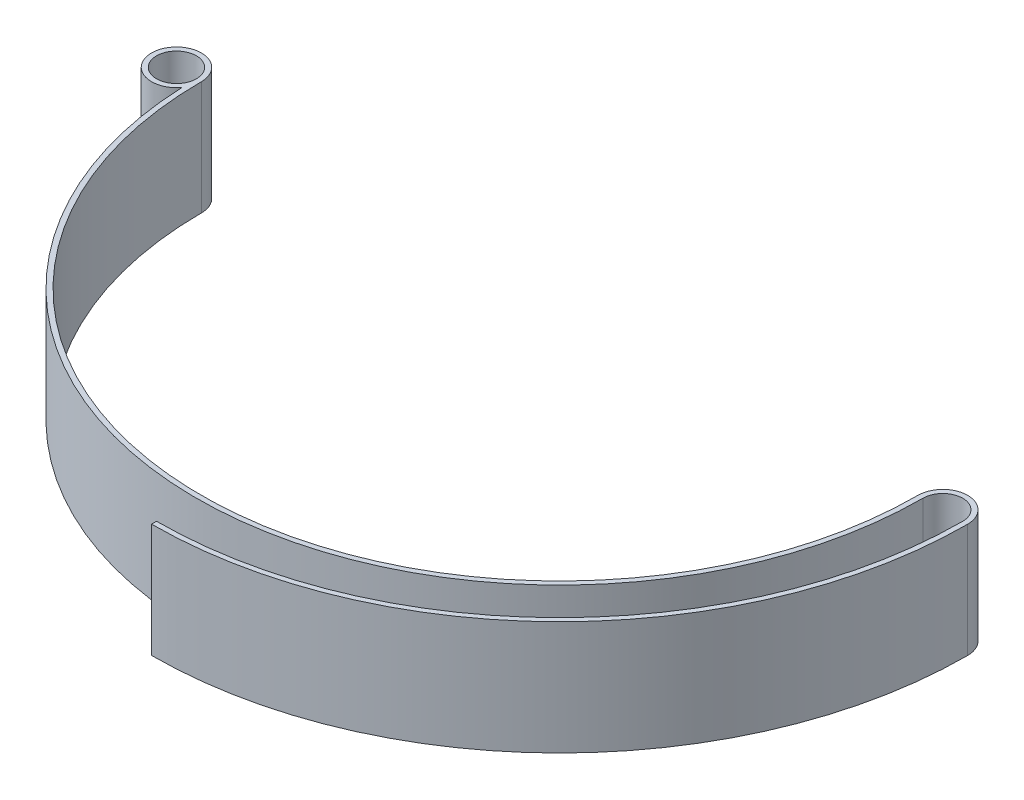
ISO-10303-21;
HEADER;
FILE_DESCRIPTION(('STEP AP214'),'2;1');
FILE_NAME('part.step','',(''),(''),'','','');
FILE_SCHEMA(('AUTOMOTIVE_DESIGN { 1 0 10303 214 1 1 1 1 }'));
ENDSEC;
DATA;
#1=APPLICATION_CONTEXT('core data for automotive mechanical design processes');
#2=APPLICATION_PROTOCOL_DEFINITION('international standard','automotive_design',2000,#1);
#3=PRODUCT_CONTEXT('',#1,'mechanical');
#4=PRODUCT('Part','Part','',(#3));
#5=PRODUCT_RELATED_PRODUCT_CATEGORY('part','',(#4));
#6=PRODUCT_DEFINITION_FORMATION('','',#4);
#7=PRODUCT_DEFINITION_CONTEXT('part definition',#1,'design');
#8=PRODUCT_DEFINITION('design','',#6,#7);
#9=PRODUCT_DEFINITION_SHAPE('','',#8);
#10=(LENGTH_UNIT() NAMED_UNIT(*) SI_UNIT(.MILLI.,.METRE.));
#11=(NAMED_UNIT(*) PLANE_ANGLE_UNIT() SI_UNIT($,.RADIAN.));
#12=(NAMED_UNIT(*) SI_UNIT($,.STERADIAN.) SOLID_ANGLE_UNIT());
#13=UNCERTAINTY_MEASURE_WITH_UNIT(LENGTH_MEASURE(1.E-05),#10,'distance_accuracy_value','');
#14=(GEOMETRIC_REPRESENTATION_CONTEXT(3) GLOBAL_UNCERTAINTY_ASSIGNED_CONTEXT((#13)) GLOBAL_UNIT_ASSIGNED_CONTEXT((#10,
#11,#12)) REPRESENTATION_CONTEXT('',''));
#15=CARTESIAN_POINT('',(0.,0.,0.));
#16=DIRECTION('',(0.,0.,1.));
#17=DIRECTION('',(1.,0.,0.));
#18=AXIS2_PLACEMENT_3D('',#15,#16,#17);
#19=CARTESIAN_POINT('',(0.,22.806,0.));
#20=DIRECTION('',(0.,1.,0.));
#21=DIRECTION('',(0.,0.,1.));
#22=AXIS2_PLACEMENT_3D('',#19,#20,#21);
#23=PLANE('',#22);
#24=CARTESIAN_POINT('',(0.,22.806,0.));
#25=DIRECTION('',(0.,1.,0.));
#26=DIRECTION('',(0.,0.,1.));
#27=AXIS2_PLACEMENT_3D('',#24,#25,#26);
#28=CIRCLE('',#27,5.);
#29=CARTESIAN_POINT('',(5.,22.806,0.));
#30=VERTEX_POINT('',#29);
#31=CARTESIAN_POINT('',(4.0585594378294,22.806,2.92029027488806));
#32=VERTEX_POINT('',#31);
#33=EDGE_CURVE('E145',#30,#32,#28,.T.);
#34=ORIENTED_EDGE('',*,*,#33,.T.);
#35=CARTESIAN_POINT('',(76.845,22.806,0.));
#36=DIRECTION('',(0.,1.,0.));
#37=DIRECTION('',(0.,0.,1.));
#38=AXIS2_PLACEMENT_3D('',#35,#36,#37);
#39=CIRCLE('',#38,72.845);
#40=CARTESIAN_POINT('',(149.69,22.806,0.));
#41=VERTEX_POINT('',#40);
#42=EDGE_CURVE('E93',#32,#41,#39,.T.);
#43=ORIENTED_EDGE('',*,*,#42,.T.);
#44=CARTESIAN_POINT('',(153.69,22.806,0.));
#45=DIRECTION('',(0.,-1.,0.));
#46=DIRECTION('',(0.,0.,-1.));
#47=AXIS2_PLACEMENT_3D('',#44,#45,#46);
#48=CIRCLE('',#47,4.);
#49=CARTESIAN_POINT('',(157.69,22.806,0.));
#50=VERTEX_POINT('',#49);
#51=EDGE_CURVE('E160',#41,#50,#48,.T.);
#52=ORIENTED_EDGE('',*,*,#51,.T.);
#53=CARTESIAN_POINT('',(76.845,22.806,0.));
#54=DIRECTION('',(0.,-1.,0.));
#55=DIRECTION('',(0.,0.,-1.));
#56=AXIS2_PLACEMENT_3D('',#53,#54,#55);
#57=CIRCLE('',#56,80.845);
#58=CARTESIAN_POINT('',(76.845,22.806,80.845));
#59=VERTEX_POINT('',#58);
#60=EDGE_CURVE('E173',#50,#59,#57,.T.);
#61=ORIENTED_EDGE('',*,*,#60,.T.);
#62=DIRECTION('',(0.,0.,1.));
#63=VECTOR('',#62,1.);
#64=CARTESIAN_POINT('',(76.845,22.806,80.845));
#65=LINE('',#64,#63);
#66=CARTESIAN_POINT('',(76.845,22.806,81.845));
#67=VERTEX_POINT('',#66);
#68=EDGE_CURVE('E112',#59,#67,#65,.T.);
#69=ORIENTED_EDGE('',*,*,#68,.T.);
#70=CARTESIAN_POINT('',(76.845,22.806,0.));
#71=DIRECTION('',(0.,1.,0.));
#72=DIRECTION('',(0.,0.,-1.));
#73=AXIS2_PLACEMENT_3D('',#70,#71,#72);
#74=CIRCLE('',#73,81.845);
#75=CARTESIAN_POINT('',(158.69,22.806,0.));
#76=VERTEX_POINT('',#75);
#77=EDGE_CURVE('E106',#67,#76,#74,.T.);
#78=ORIENTED_EDGE('',*,*,#77,.T.);
#79=CARTESIAN_POINT('',(153.69,22.806,0.));
#80=DIRECTION('',(0.,1.,0.));
#81=DIRECTION('',(0.,0.,-1.));
#82=AXIS2_PLACEMENT_3D('',#79,#80,#81);
#83=CIRCLE('',#82,4.99999999999999);
#84=CARTESIAN_POINT('',(148.69,22.806,0.));
#85=VERTEX_POINT('',#84);
#86=EDGE_CURVE('E110',#76,#85,#83,.T.);
#87=ORIENTED_EDGE('',*,*,#86,.T.);
#88=CARTESIAN_POINT('',(76.845,22.806,0.));
#89=DIRECTION('',(0.,-1.,0.));
#90=DIRECTION('',(0.,0.,1.));
#91=AXIS2_PLACEMENT_3D('',#88,#89,#90);
#92=CIRCLE('',#91,71.845);
#93=EDGE_CURVE('E50',#85,#30,#92,.T.);
#94=ORIENTED_EDGE('',*,*,#93,.T.);
#95=EDGE_LOOP('',(#34,#43,#52,#61,#69,#78,#87,#94));
#96=FACE_BOUND('',#95,.T.);
#97=CARTESIAN_POINT('',(0.,22.806,0.));
#98=DIRECTION('',(0.,1.,0.));
#99=DIRECTION('',(0.,0.,1.));
#100=AXIS2_PLACEMENT_3D('',#97,#98,#99);
#101=CIRCLE('',#100,4.);
#102=CARTESIAN_POINT('',(0.,22.806,4.));
#103=VERTEX_POINT('',#102);
#104=EDGE_CURVE('E134',#103,#103,#101,.T.);
#105=ORIENTED_EDGE('',*,*,#104,.F.);
#106=EDGE_LOOP('',(#105));
#107=FACE_BOUND('',#106,.T.);
#108=ADVANCED_FACE('F33',(#96,#107),#23,.T.);
#109=CARTESIAN_POINT('',(0.,0.,0.));
#110=DIRECTION('',(0.,1.,0.));
#111=DIRECTION('',(0.,0.,1.));
#112=AXIS2_PLACEMENT_3D('',#109,#110,#111);
#113=PLANE('',#112);
#114=CARTESIAN_POINT('',(0.,0.,0.));
#115=DIRECTION('',(0.,1.,0.));
#116=DIRECTION('',(0.,0.,1.));
#117=AXIS2_PLACEMENT_3D('',#114,#115,#116);
#118=CIRCLE('',#117,5.);
#119=CARTESIAN_POINT('',(5.,0.,0.));
#120=VERTEX_POINT('',#119);
#121=CARTESIAN_POINT('',(4.0585594378294,0.,2.92029027488806));
#122=VERTEX_POINT('',#121);
#123=EDGE_CURVE('E130',#120,#122,#118,.T.);
#124=ORIENTED_EDGE('',*,*,#123,.F.);
#125=CARTESIAN_POINT('',(76.845,0.,0.));
#126=DIRECTION('',(0.,-1.,0.));
#127=DIRECTION('',(0.,0.,1.));
#128=AXIS2_PLACEMENT_3D('',#125,#126,#127);
#129=CIRCLE('',#128,71.845);
#130=CARTESIAN_POINT('',(148.69,0.,0.));
#131=VERTEX_POINT('',#130);
#132=EDGE_CURVE('E85',#131,#120,#129,.T.);
#133=ORIENTED_EDGE('',*,*,#132,.F.);
#134=CARTESIAN_POINT('',(153.69,0.,0.));
#135=DIRECTION('',(0.,1.,0.));
#136=DIRECTION('',(0.,0.,-1.));
#137=AXIS2_PLACEMENT_3D('',#134,#135,#136);
#138=CIRCLE('',#137,4.99999999999999);
#139=CARTESIAN_POINT('',(158.69,0.,0.));
#140=VERTEX_POINT('',#139);
#141=EDGE_CURVE('E79',#140,#131,#138,.T.);
#142=ORIENTED_EDGE('',*,*,#141,.F.);
#143=CARTESIAN_POINT('',(76.845,0.,0.));
#144=DIRECTION('',(0.,1.,0.));
#145=DIRECTION('',(0.,0.,-1.));
#146=AXIS2_PLACEMENT_3D('',#143,#144,#145);
#147=CIRCLE('',#146,81.845);
#148=CARTESIAN_POINT('',(76.845,0.,81.845));
#149=VERTEX_POINT('',#148);
#150=EDGE_CURVE('E120',#149,#140,#147,.T.);
#151=ORIENTED_EDGE('',*,*,#150,.F.);
#152=DIRECTION('',(0.,0.,1.));
#153=VECTOR('',#152,1.);
#154=CARTESIAN_POINT('',(76.845,0.,80.845));
#155=LINE('',#154,#153);
#156=CARTESIAN_POINT('',(76.845,0.,80.845));
#157=VERTEX_POINT('',#156);
#158=EDGE_CURVE('E140',#157,#149,#155,.T.);
#159=ORIENTED_EDGE('',*,*,#158,.F.);
#160=CARTESIAN_POINT('',(76.845,0.,0.));
#161=DIRECTION('',(0.,-1.,0.));
#162=DIRECTION('',(0.,0.,-1.));
#163=AXIS2_PLACEMENT_3D('',#160,#161,#162);
#164=CIRCLE('',#163,80.845);
#165=CARTESIAN_POINT('',(157.69,0.,0.));
#166=VERTEX_POINT('',#165);
#167=EDGE_CURVE('E138',#166,#157,#164,.T.);
#168=ORIENTED_EDGE('',*,*,#167,.F.);
#169=CARTESIAN_POINT('',(153.69,0.,0.));
#170=DIRECTION('',(0.,-1.,0.));
#171=DIRECTION('',(0.,0.,-1.));
#172=AXIS2_PLACEMENT_3D('',#169,#170,#171);
#173=CIRCLE('',#172,4.);
#174=CARTESIAN_POINT('',(149.69,0.,0.));
#175=VERTEX_POINT('',#174);
#176=EDGE_CURVE('E136',#175,#166,#173,.T.);
#177=ORIENTED_EDGE('',*,*,#176,.F.);
#178=CARTESIAN_POINT('',(76.845,0.,0.));
#179=DIRECTION('',(0.,1.,0.));
#180=DIRECTION('',(0.,0.,1.));
#181=AXIS2_PLACEMENT_3D('',#178,#179,#180);
#182=CIRCLE('',#181,72.845);
#183=EDGE_CURVE('E133',#122,#175,#182,.T.);
#184=ORIENTED_EDGE('',*,*,#183,.F.);
#185=EDGE_LOOP('',(#124,#133,#142,#151,#159,#168,#177,#184));
#186=FACE_BOUND('',#185,.T.);
#187=CARTESIAN_POINT('',(0.,0.,0.));
#188=DIRECTION('',(0.,1.,0.));
#189=DIRECTION('',(0.,0.,1.));
#190=AXIS2_PLACEMENT_3D('',#187,#188,#189);
#191=CIRCLE('',#190,4.);
#192=CARTESIAN_POINT('',(0.,0.,4.));
#193=VERTEX_POINT('',#192);
#194=EDGE_CURVE('E179',#193,#193,#191,.T.);
#195=ORIENTED_EDGE('',*,*,#194,.T.);
#196=EDGE_LOOP('',(#195));
#197=FACE_BOUND('',#196,.T.);
#198=ADVANCED_FACE('F164',(#186,#197),#113,.F.);
#199=CARTESIAN_POINT('',(0.,22.806,0.));
#200=DIRECTION('',(0.,-1.,0.));
#201=DIRECTION('',(0.,0.,-1.));
#202=AXIS2_PLACEMENT_3D('',#199,#200,#201);
#203=CYLINDRICAL_SURFACE('',#202,5.);
#204=ORIENTED_EDGE('',*,*,#123,.T.);
#205=DIRECTION('',(0.,-1.,0.));
#206=VECTOR('',#205,1.);
#207=CARTESIAN_POINT('',(4.0585594378294,22.806,2.92029027488806));
#208=LINE('',#207,#206);
#209=EDGE_CURVE('E11',#32,#122,#208,.T.);
#210=ORIENTED_EDGE('',*,*,#209,.F.);
#211=ORIENTED_EDGE('',*,*,#33,.F.);
#212=DIRECTION('',(0.,-1.,0.));
#213=VECTOR('',#212,1.);
#214=CARTESIAN_POINT('',(5.,22.806,0.));
#215=LINE('',#214,#213);
#216=EDGE_CURVE('E126',#30,#120,#215,.T.);
#217=ORIENTED_EDGE('',*,*,#216,.T.);
#218=EDGE_LOOP('',(#204,#210,#211,#217));
#219=FACE_BOUND('',#218,.T.);
#220=ADVANCED_FACE('F35',(#219),#203,.T.);
#221=CARTESIAN_POINT('',(76.845,22.806,0.));
#222=DIRECTION('',(0.,-1.,0.));
#223=DIRECTION('',(0.,0.,-1.));
#224=AXIS2_PLACEMENT_3D('',#221,#222,#223);
#225=CYLINDRICAL_SURFACE('',#224,72.845);
#226=ORIENTED_EDGE('',*,*,#183,.T.);
#227=DIRECTION('',(0.,-1.,0.));
#228=VECTOR('',#227,1.);
#229=CARTESIAN_POINT('',(149.69,22.806,0.));
#230=LINE('',#229,#228);
#231=EDGE_CURVE('E42',#41,#175,#230,.T.);
#232=ORIENTED_EDGE('',*,*,#231,.F.);
#233=ORIENTED_EDGE('',*,*,#42,.F.);
#234=ORIENTED_EDGE('',*,*,#209,.T.);
#235=EDGE_LOOP('',(#226,#232,#233,#234));
#236=FACE_BOUND('',#235,.T.);
#237=ADVANCED_FACE('F207',(#236),#225,.T.);
#238=CARTESIAN_POINT('',(153.69,22.806,0.));
#239=DIRECTION('',(0.,-1.,0.));
#240=DIRECTION('',(0.,0.,-1.));
#241=AXIS2_PLACEMENT_3D('',#238,#239,#240);
#242=CYLINDRICAL_SURFACE('',#241,4.);
#243=ORIENTED_EDGE('',*,*,#176,.T.);
#244=DIRECTION('',(0.,-1.,0.));
#245=VECTOR('',#244,1.);
#246=CARTESIAN_POINT('',(157.69,22.806,0.));
#247=LINE('',#246,#245);
#248=EDGE_CURVE('E152',#50,#166,#247,.T.);
#249=ORIENTED_EDGE('',*,*,#248,.F.);
#250=ORIENTED_EDGE('',*,*,#51,.F.);
#251=ORIENTED_EDGE('',*,*,#231,.T.);
#252=EDGE_LOOP('',(#243,#249,#250,#251));
#253=FACE_BOUND('',#252,.T.);
#254=ADVANCED_FACE('F158',(#253),#242,.F.);
#255=CARTESIAN_POINT('',(76.845,22.806,0.));
#256=DIRECTION('',(0.,-1.,0.));
#257=DIRECTION('',(0.,0.,-1.));
#258=AXIS2_PLACEMENT_3D('',#255,#256,#257);
#259=CYLINDRICAL_SURFACE('',#258,80.845);
#260=ORIENTED_EDGE('',*,*,#167,.T.);
#261=DIRECTION('',(0.,-1.,0.));
#262=VECTOR('',#261,1.);
#263=CARTESIAN_POINT('',(76.845,22.806,80.845));
#264=LINE('',#263,#262);
#265=EDGE_CURVE('E149',#59,#157,#264,.T.);
#266=ORIENTED_EDGE('',*,*,#265,.F.);
#267=ORIENTED_EDGE('',*,*,#60,.F.);
#268=ORIENTED_EDGE('',*,*,#248,.T.);
#269=EDGE_LOOP('',(#260,#266,#267,#268));
#270=FACE_BOUND('',#269,.T.);
#271=ADVANCED_FACE('F169',(#270),#259,.F.);
#272=CARTESIAN_POINT('',(76.845,22.806,80.845));
#273=DIRECTION('',(1.,0.,0.));
#274=DIRECTION('',(0.,0.,-1.));
#275=AXIS2_PLACEMENT_3D('',#272,#273,#274);
#276=PLANE('',#275);
#277=ORIENTED_EDGE('',*,*,#158,.T.);
#278=DIRECTION('',(0.,-1.,0.));
#279=VECTOR('',#278,1.);
#280=CARTESIAN_POINT('',(76.845,22.806,81.845));
#281=LINE('',#280,#279);
#282=EDGE_CURVE('E121',#67,#149,#281,.T.);
#283=ORIENTED_EDGE('',*,*,#282,.F.);
#284=ORIENTED_EDGE('',*,*,#68,.F.);
#285=ORIENTED_EDGE('',*,*,#265,.T.);
#286=EDGE_LOOP('',(#277,#283,#284,#285));
#287=FACE_BOUND('',#286,.T.);
#288=ADVANCED_FACE('F172',(#287),#276,.F.);
#289=CARTESIAN_POINT('',(76.845,22.806,0.));
#290=DIRECTION('',(0.,-1.,0.));
#291=DIRECTION('',(0.,0.,-1.));
#292=AXIS2_PLACEMENT_3D('',#289,#290,#291);
#293=CYLINDRICAL_SURFACE('',#292,81.845);
#294=ORIENTED_EDGE('',*,*,#150,.T.);
#295=DIRECTION('',(0.,-1.,0.));
#296=VECTOR('',#295,1.);
#297=CARTESIAN_POINT('',(158.69,22.806,0.));
#298=LINE('',#297,#296);
#299=EDGE_CURVE('E117',#76,#140,#298,.T.);
#300=ORIENTED_EDGE('',*,*,#299,.F.);
#301=ORIENTED_EDGE('',*,*,#77,.F.);
#302=ORIENTED_EDGE('',*,*,#282,.T.);
#303=EDGE_LOOP('',(#294,#300,#301,#302));
#304=FACE_BOUND('',#303,.T.);
#305=ADVANCED_FACE('F118',(#304),#293,.T.);
#306=CARTESIAN_POINT('',(153.69,22.806,0.));
#307=DIRECTION('',(0.,-1.,0.));
#308=DIRECTION('',(0.,0.,-1.));
#309=AXIS2_PLACEMENT_3D('',#306,#307,#308);
#310=CYLINDRICAL_SURFACE('',#309,4.99999999999999);
#311=ORIENTED_EDGE('',*,*,#141,.T.);
#312=DIRECTION('',(0.,-1.,0.));
#313=VECTOR('',#312,1.);
#314=CARTESIAN_POINT('',(148.69,22.806,0.));
#315=LINE('',#314,#313);
#316=EDGE_CURVE('E122',#85,#131,#315,.T.);
#317=ORIENTED_EDGE('',*,*,#316,.F.);
#318=ORIENTED_EDGE('',*,*,#86,.F.);
#319=ORIENTED_EDGE('',*,*,#299,.T.);
#320=EDGE_LOOP('',(#311,#317,#318,#319));
#321=FACE_BOUND('',#320,.T.);
#322=ADVANCED_FACE('F124',(#321),#310,.T.);
#323=CARTESIAN_POINT('',(76.845,22.806,0.));
#324=DIRECTION('',(0.,-1.,0.));
#325=DIRECTION('',(0.,0.,-1.));
#326=AXIS2_PLACEMENT_3D('',#323,#324,#325);
#327=CYLINDRICAL_SURFACE('',#326,71.845);
#328=ORIENTED_EDGE('',*,*,#132,.T.);
#329=ORIENTED_EDGE('',*,*,#216,.F.);
#330=ORIENTED_EDGE('',*,*,#93,.F.);
#331=ORIENTED_EDGE('',*,*,#316,.T.);
#332=EDGE_LOOP('',(#328,#329,#330,#331));
#333=FACE_BOUND('',#332,.T.);
#334=ADVANCED_FACE('F195',(#333),#327,.F.);
#335=CARTESIAN_POINT('',(0.,22.806,0.));
#336=DIRECTION('',(0.,-1.,0.));
#337=DIRECTION('',(0.,0.,-1.));
#338=AXIS2_PLACEMENT_3D('',#335,#336,#337);
#339=CYLINDRICAL_SURFACE('',#338,4.);
#340=ORIENTED_EDGE('',*,*,#104,.T.);
#341=EDGE_LOOP('',(#340));
#342=FACE_BOUND('',#341,.T.);
#343=ORIENTED_EDGE('',*,*,#194,.F.);
#344=EDGE_LOOP('',(#343));
#345=FACE_BOUND('',#344,.T.);
#346=ADVANCED_FACE('F185',(#342,#345),#339,.F.);
#347=CLOSED_SHELL('',(#108,#198,#220,#237,#254,#271,#288,#305,#322,#334,#346));
#348=MANIFOLD_SOLID_BREP('B2',#347);
#349=ADVANCED_BREP_SHAPE_REPRESENTATION('',(#18,#348),#14);
#350=SHAPE_DEFINITION_REPRESENTATION(#9,#349);
ENDSEC;
END-ISO-10303-21;
